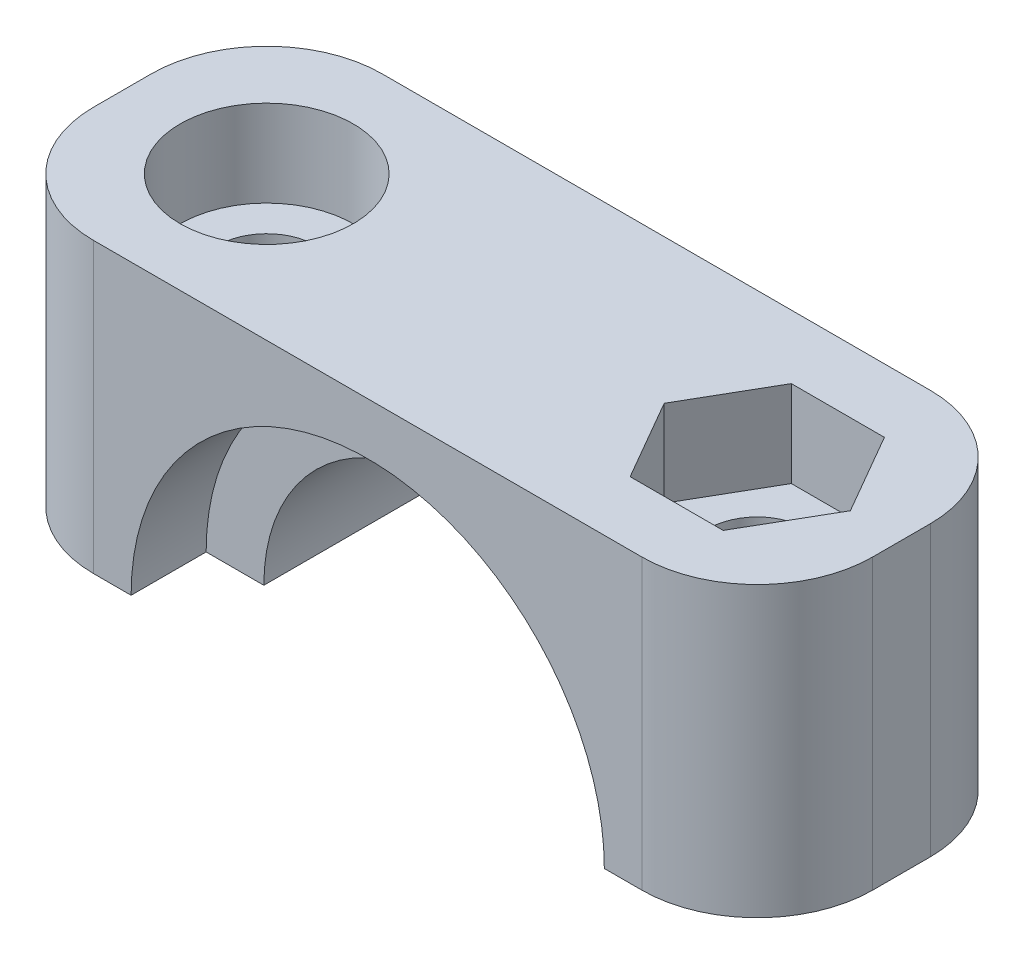
ISO-10303-21;
HEADER;
FILE_DESCRIPTION(('STEP AP214'),'2;1');
FILE_NAME('part.step','',(''),(''),'','','');
FILE_SCHEMA(('AUTOMOTIVE_DESIGN { 1 0 10303 214 1 1 1 1 }'));
ENDSEC;
DATA;
#1=APPLICATION_CONTEXT('core data for automotive mechanical design processes');
#2=APPLICATION_PROTOCOL_DEFINITION('international standard','automotive_design',2000,#1);
#3=PRODUCT_CONTEXT('',#1,'mechanical');
#4=PRODUCT('Part','Part','',(#3));
#5=PRODUCT_RELATED_PRODUCT_CATEGORY('part','',(#4));
#6=PRODUCT_DEFINITION_FORMATION('','',#4);
#7=PRODUCT_DEFINITION_CONTEXT('part definition',#1,'design');
#8=PRODUCT_DEFINITION('design','',#6,#7);
#9=PRODUCT_DEFINITION_SHAPE('','',#8);
#10=(LENGTH_UNIT() NAMED_UNIT(*) SI_UNIT(.MILLI.,.METRE.));
#11=(NAMED_UNIT(*) PLANE_ANGLE_UNIT() SI_UNIT($,.RADIAN.));
#12=(NAMED_UNIT(*) SI_UNIT($,.STERADIAN.) SOLID_ANGLE_UNIT());
#13=UNCERTAINTY_MEASURE_WITH_UNIT(LENGTH_MEASURE(1.E-05),#10,'distance_accuracy_value','');
#14=(GEOMETRIC_REPRESENTATION_CONTEXT(3) GLOBAL_UNCERTAINTY_ASSIGNED_CONTEXT((#13)) GLOBAL_UNIT_ASSIGNED_CONTEXT((#10,
#11,#12)) REPRESENTATION_CONTEXT('',''));
#15=CARTESIAN_POINT('',(0.,0.,0.));
#16=DIRECTION('',(0.,0.,1.));
#17=DIRECTION('',(1.,0.,0.));
#18=AXIS2_PLACEMENT_3D('',#15,#16,#17);
#19=CARTESIAN_POINT('',(8.5,-5.,5.));
#20=DIRECTION('',(0.,1.,0.));
#21=DIRECTION('',(0.,0.,1.));
#22=AXIS2_PLACEMENT_3D('',#19,#20,#21);
#23=CYLINDRICAL_SURFACE('',#22,1.7);
#24=CARTESIAN_POINT('',(8.5,-5.,5.));
#25=DIRECTION('',(0.,1.,0.));
#26=DIRECTION('',(0.,0.,1.));
#27=AXIS2_PLACEMENT_3D('',#24,#25,#26);
#28=CIRCLE('',#27,1.7);
#29=CARTESIAN_POINT('',(8.5,-5.,6.7));
#30=VERTEX_POINT('',#29);
#31=EDGE_CURVE('E233',#30,#30,#28,.T.);
#32=ORIENTED_EDGE('',*,*,#31,.F.);
#33=EDGE_LOOP('',(#32));
#34=FACE_BOUND('',#33,.T.);
#35=CARTESIAN_POINT('',(8.5,2.,5.));
#36=DIRECTION('',(0.,1.,0.));
#37=DIRECTION('',(0.,0.,1.));
#38=AXIS2_PLACEMENT_3D('',#35,#36,#37);
#39=CIRCLE('',#38,1.7);
#40=CARTESIAN_POINT('',(8.5,2.,6.7));
#41=VERTEX_POINT('',#40);
#42=EDGE_CURVE('E36',#41,#41,#39,.F.);
#43=ORIENTED_EDGE('',*,*,#42,.F.);
#44=EDGE_LOOP('',(#43));
#45=FACE_BOUND('',#44,.T.);
#46=ADVANCED_FACE('F32',(#34,#45),#23,.F.);
#47=CARTESIAN_POINT('',(-8.5,-5.,5.));
#48=DIRECTION('',(0.,1.,0.));
#49=DIRECTION('',(0.,0.,1.));
#50=AXIS2_PLACEMENT_3D('',#47,#48,#49);
#51=CYLINDRICAL_SURFACE('',#50,1.7);
#52=CARTESIAN_POINT('',(-8.5,-5.,5.));
#53=DIRECTION('',(0.,1.,0.));
#54=DIRECTION('',(0.,0.,1.));
#55=AXIS2_PLACEMENT_3D('',#52,#53,#54);
#56=CIRCLE('',#55,1.7);
#57=CARTESIAN_POINT('',(-8.5,-5.,6.7));
#58=VERTEX_POINT('',#57);
#59=EDGE_CURVE('E236',#58,#58,#56,.T.);
#60=ORIENTED_EDGE('',*,*,#59,.F.);
#61=EDGE_LOOP('',(#60));
#62=FACE_BOUND('',#61,.T.);
#63=CARTESIAN_POINT('',(-8.5,2.,5.));
#64=DIRECTION('',(0.,1.,0.));
#65=DIRECTION('',(0.,0.,1.));
#66=AXIS2_PLACEMENT_3D('',#63,#64,#65);
#67=CIRCLE('',#66,1.7);
#68=CARTESIAN_POINT('',(-8.5,2.,6.7));
#69=VERTEX_POINT('',#68);
#70=EDGE_CURVE('E229',#69,#69,#67,.F.);
#71=ORIENTED_EDGE('',*,*,#70,.F.);
#72=EDGE_LOOP('',(#71));
#73=FACE_BOUND('',#72,.T.);
#74=ADVANCED_FACE('F339',(#62,#73),#51,.F.);
#75=CARTESIAN_POINT('',(0.,-5.,10.));
#76=DIRECTION('',(0.,0.,-1.));
#77=DIRECTION('',(-1.,0.,0.));
#78=AXIS2_PLACEMENT_3D('',#75,#76,#77);
#79=CYLINDRICAL_SURFACE('',#78,8.2);
#80=CARTESIAN_POINT('',(0.,-5.,2.));
#81=DIRECTION('',(0.,0.,1.));
#82=DIRECTION('',(1.,0.,0.));
#83=AXIS2_PLACEMENT_3D('',#80,#81,#82);
#84=CIRCLE('',#83,8.2);
#85=CARTESIAN_POINT('',(8.2,-5.,2.));
#86=VERTEX_POINT('',#85);
#87=CARTESIAN_POINT('',(-8.2,-5.,2.));
#88=VERTEX_POINT('',#87);
#89=EDGE_CURVE('E239',#86,#88,#84,.T.);
#90=ORIENTED_EDGE('',*,*,#89,.T.);
#91=DIRECTION('',(0.,0.,-1.));
#92=VECTOR('',#91,1.);
#93=CARTESIAN_POINT('',(-8.2,-5.,10.));
#94=LINE('',#93,#92);
#95=CARTESIAN_POINT('',(-8.2,-5.,0.));
#96=VERTEX_POINT('',#95);
#97=EDGE_CURVE('E269',#96,#88,#94,.F.);
#98=ORIENTED_EDGE('',*,*,#97,.F.);
#99=CARTESIAN_POINT('',(0.,-5.,0.));
#100=DIRECTION('',(0.,0.,-1.));
#101=DIRECTION('',(-1.,0.,0.));
#102=AXIS2_PLACEMENT_3D('',#99,#100,#101);
#103=CIRCLE('',#102,8.2);
#104=CARTESIAN_POINT('',(8.2,-5.,0.));
#105=VERTEX_POINT('',#104);
#106=EDGE_CURVE('E262',#96,#105,#103,.T.);
#107=ORIENTED_EDGE('',*,*,#106,.T.);
#108=DIRECTION('',(0.,0.,-1.));
#109=VECTOR('',#108,1.);
#110=CARTESIAN_POINT('',(8.2,-5.,10.));
#111=LINE('',#110,#109);
#112=EDGE_CURVE('E272',#86,#105,#111,.T.);
#113=ORIENTED_EDGE('',*,*,#112,.F.);
#114=EDGE_LOOP('',(#90,#98,#107,#113));
#115=FACE_BOUND('',#114,.T.);
#116=ADVANCED_FACE('F341',(#115),#79,.F.);
#117=CARTESIAN_POINT('',(-13.5,-5.,10.));
#118=DIRECTION('',(0.,1.,0.));
#119=DIRECTION('',(0.,0.,1.));
#120=AXIS2_PLACEMENT_3D('',#117,#118,#119);
#121=PLANE('',#120);
#122=ORIENTED_EDGE('',*,*,#31,.T.);
#123=EDGE_LOOP('',(#122));
#124=FACE_BOUND('',#123,.T.);
#125=DIRECTION('',(1.,0.,0.));
#126=VECTOR('',#125,1.);
#127=CARTESIAN_POINT('',(-13.5,-5.,10.));
#128=LINE('',#127,#126);
#129=CARTESIAN_POINT('',(8.2,-5.,10.));
#130=VERTEX_POINT('',#129);
#131=CARTESIAN_POINT('',(9.5,-5.,10.));
#132=VERTEX_POINT('',#131);
#133=EDGE_CURVE('E279',#130,#132,#128,.T.);
#134=ORIENTED_EDGE('',*,*,#133,.F.);
#135=CARTESIAN_POINT('',(8.2,-5.,7.4));
#136=VERTEX_POINT('',#135);
#137=EDGE_CURVE('E273',#130,#136,#111,.T.);
#138=ORIENTED_EDGE('',*,*,#137,.T.);
#139=DIRECTION('',(1.,0.,0.));
#140=VECTOR('',#139,1.);
#141=CARTESIAN_POINT('',(8.2,-5.,7.4));
#142=LINE('',#141,#140);
#143=CARTESIAN_POINT('',(6.2,-5.,7.4));
#144=VERTEX_POINT('',#143);
#145=EDGE_CURVE('E246',#144,#136,#142,.T.);
#146=ORIENTED_EDGE('',*,*,#145,.F.);
#147=DIRECTION('',(0.,0.,-1.));
#148=VECTOR('',#147,1.);
#149=CARTESIAN_POINT('',(6.2,-5.,7.4));
#150=LINE('',#149,#148);
#151=CARTESIAN_POINT('',(6.2,-5.,2.));
#152=VERTEX_POINT('',#151);
#153=EDGE_CURVE('E249',#144,#152,#150,.T.);
#154=ORIENTED_EDGE('',*,*,#153,.T.);
#155=DIRECTION('',(1.,0.,0.));
#156=VECTOR('',#155,1.);
#157=CARTESIAN_POINT('',(8.2,-5.,2.));
#158=LINE('',#157,#156);
#159=EDGE_CURVE('E242',#152,#86,#158,.T.);
#160=ORIENTED_EDGE('',*,*,#159,.T.);
#161=ORIENTED_EDGE('',*,*,#112,.T.);
#162=DIRECTION('',(1.,0.,0.));
#163=VECTOR('',#162,1.);
#164=CARTESIAN_POINT('',(-13.5,-5.,0.));
#165=LINE('',#164,#163);
#166=CARTESIAN_POINT('',(9.5,-5.,0.));
#167=VERTEX_POINT('',#166);
#168=EDGE_CURVE('E287',#105,#167,#165,.T.);
#169=ORIENTED_EDGE('',*,*,#168,.T.);
#170=CARTESIAN_POINT('',(9.5,-5.,4.));
#171=DIRECTION('',(0.,1.,0.));
#172=DIRECTION('',(0.,0.,1.));
#173=AXIS2_PLACEMENT_3D('',#170,#171,#172);
#174=CIRCLE('',#173,4.);
#175=CARTESIAN_POINT('',(13.5,-5.,4.));
#176=VERTEX_POINT('',#175);
#177=EDGE_CURVE('E326',#167,#176,#174,.F.);
#178=ORIENTED_EDGE('',*,*,#177,.T.);
#179=DIRECTION('',(0.,0.,-1.));
#180=VECTOR('',#179,1.);
#181=CARTESIAN_POINT('',(13.5,-5.,10.));
#182=LINE('',#181,#180);
#183=CARTESIAN_POINT('',(13.5,-5.,6.));
#184=VERTEX_POINT('',#183);
#185=EDGE_CURVE('E284',#184,#176,#182,.T.);
#186=ORIENTED_EDGE('',*,*,#185,.F.);
#187=CARTESIAN_POINT('',(9.5,-5.,6.));
#188=DIRECTION('',(0.,1.,0.));
#189=DIRECTION('',(0.,0.,1.));
#190=AXIS2_PLACEMENT_3D('',#187,#188,#189);
#191=CIRCLE('',#190,4.);
#192=EDGE_CURVE('E323',#184,#132,#191,.F.);
#193=ORIENTED_EDGE('',*,*,#192,.T.);
#194=EDGE_LOOP('',(#134,#138,#146,#154,#160,#161,#169,#178,#186,#193));
#195=FACE_BOUND('',#194,.T.);
#196=ADVANCED_FACE('F348',(#124,#195),#121,.F.);
#197=CARTESIAN_POINT('',(13.5,-5.,10.));
#198=DIRECTION('',(-1.,0.,0.));
#199=DIRECTION('',(0.,0.,1.));
#200=AXIS2_PLACEMENT_3D('',#197,#198,#199);
#201=PLANE('',#200);
#202=ORIENTED_EDGE('',*,*,#185,.T.);
#203=DIRECTION('',(0.,1.,0.));
#204=VECTOR('',#203,1.);
#205=CARTESIAN_POINT('',(13.5,5.,4.));
#206=LINE('',#205,#204);
#207=CARTESIAN_POINT('',(13.5,5.,4.));
#208=VERTEX_POINT('',#207);
#209=EDGE_CURVE('E303',#176,#208,#206,.T.);
#210=ORIENTED_EDGE('',*,*,#209,.T.);
#211=DIRECTION('',(0.,0.,-1.));
#212=VECTOR('',#211,1.);
#213=CARTESIAN_POINT('',(13.5,5.,10.));
#214=LINE('',#213,#212);
#215=CARTESIAN_POINT('',(13.5,5.,6.));
#216=VERTEX_POINT('',#215);
#217=EDGE_CURVE('E298',#216,#208,#214,.T.);
#218=ORIENTED_EDGE('',*,*,#217,.F.);
#219=DIRECTION('',(0.,1.,0.));
#220=VECTOR('',#219,1.);
#221=CARTESIAN_POINT('',(13.5,-5.,6.));
#222=LINE('',#221,#220);
#223=EDGE_CURVE('E301',#216,#184,#222,.F.);
#224=ORIENTED_EDGE('',*,*,#223,.T.);
#225=EDGE_LOOP('',(#202,#210,#218,#224));
#226=FACE_BOUND('',#225,.T.);
#227=ADVANCED_FACE('F390',(#226),#201,.F.);
#228=CARTESIAN_POINT('',(-13.5,5.,10.));
#229=DIRECTION('',(0.,-1.,0.));
#230=DIRECTION('',(0.,0.,-1.));
#231=AXIS2_PLACEMENT_3D('',#228,#229,#230);
#232=PLANE('',#231);
#233=DIRECTION('',(1.,0.,0.));
#234=VECTOR('',#233,1.);
#235=CARTESIAN_POINT('',(6.88728460632127,5.,7.793305));
#236=LINE('',#235,#234);
#237=CARTESIAN_POINT('',(6.88728460632127,5.,7.793305));
#238=VERTEX_POINT('',#237);
#239=CARTESIAN_POINT('',(10.1127153936787,5.,7.793305));
#240=VERTEX_POINT('',#239);
#241=EDGE_CURVE('E207',#238,#240,#236,.T.);
#242=ORIENTED_EDGE('',*,*,#241,.F.);
#243=DIRECTION('',(0.5,0.,0.866025403784438));
#244=VECTOR('',#243,1.);
#245=CARTESIAN_POINT('',(5.27456921264254,5.,5.));
#246=LINE('',#245,#244);
#247=CARTESIAN_POINT('',(5.27456921264254,5.,5.));
#248=VERTEX_POINT('',#247);
#249=EDGE_CURVE('E49',#248,#238,#246,.T.);
#250=ORIENTED_EDGE('',*,*,#249,.F.);
#251=DIRECTION('',(-0.5,0.,0.866025403784439));
#252=VECTOR('',#251,1.);
#253=CARTESIAN_POINT('',(6.88728460632127,5.,2.206695));
#254=LINE('',#253,#252);
#255=CARTESIAN_POINT('',(6.88728460632127,5.,2.206695));
#256=VERTEX_POINT('',#255);
#257=EDGE_CURVE('E193',#256,#248,#254,.T.);
#258=ORIENTED_EDGE('',*,*,#257,.F.);
#259=DIRECTION('',(-1.,0.,0.));
#260=VECTOR('',#259,1.);
#261=CARTESIAN_POINT('',(10.1127153936787,5.,2.206695));
#262=LINE('',#261,#260);
#263=CARTESIAN_POINT('',(10.1127153936787,5.,2.206695));
#264=VERTEX_POINT('',#263);
#265=EDGE_CURVE('E196',#264,#256,#262,.T.);
#266=ORIENTED_EDGE('',*,*,#265,.F.);
#267=DIRECTION('',(-0.5,0.,-0.866025403784438));
#268=VECTOR('',#267,1.);
#269=CARTESIAN_POINT('',(11.7254307873575,5.,5.));
#270=LINE('',#269,#268);
#271=CARTESIAN_POINT('',(11.7254307873575,5.,5.));
#272=VERTEX_POINT('',#271);
#273=EDGE_CURVE('E212',#272,#264,#270,.T.);
#274=ORIENTED_EDGE('',*,*,#273,.F.);
#275=DIRECTION('',(0.5,0.,-0.866025403784439));
#276=VECTOR('',#275,1.);
#277=CARTESIAN_POINT('',(10.1127153936787,5.,7.793305));
#278=LINE('',#277,#276);
#279=EDGE_CURVE('E209',#240,#272,#278,.T.);
#280=ORIENTED_EDGE('',*,*,#279,.F.);
#281=EDGE_LOOP('',(#242,#250,#258,#266,#274,#280));
#282=FACE_BOUND('',#281,.T.);
#283=CARTESIAN_POINT('',(-8.5,5.,5.));
#284=DIRECTION('',(0.,1.,0.));
#285=DIRECTION('',(0.,0.,1.));
#286=AXIS2_PLACEMENT_3D('',#283,#284,#285);
#287=CIRCLE('',#286,3.);
#288=CARTESIAN_POINT('',(-8.5,5.,8.));
#289=VERTEX_POINT('',#288);
#290=EDGE_CURVE('E230',#289,#289,#287,.T.);
#291=ORIENTED_EDGE('',*,*,#290,.F.);
#292=EDGE_LOOP('',(#291));
#293=FACE_BOUND('',#292,.T.);
#294=ORIENTED_EDGE('',*,*,#217,.T.);
#295=CARTESIAN_POINT('',(9.5,5.,4.));
#296=DIRECTION('',(0.,-1.,0.));
#297=DIRECTION('',(0.,0.,-1.));
#298=AXIS2_PLACEMENT_3D('',#295,#296,#297);
#299=CIRCLE('',#298,4.);
#300=CARTESIAN_POINT('',(9.5,5.,0.));
#301=VERTEX_POINT('',#300);
#302=EDGE_CURVE('E312',#208,#301,#299,.F.);
#303=ORIENTED_EDGE('',*,*,#302,.T.);
#304=DIRECTION('',(-1.,0.,0.));
#305=VECTOR('',#304,1.);
#306=CARTESIAN_POINT('',(-13.5,5.,0.));
#307=LINE('',#306,#305);
#308=CARTESIAN_POINT('',(-9.5,5.,0.));
#309=VERTEX_POINT('',#308);
#310=EDGE_CURVE('E275',#301,#309,#307,.T.);
#311=ORIENTED_EDGE('',*,*,#310,.T.);
#312=CARTESIAN_POINT('',(-9.5,5.,4.));
#313=DIRECTION('',(0.,-1.,0.));
#314=DIRECTION('',(0.,0.,-1.));
#315=AXIS2_PLACEMENT_3D('',#312,#313,#314);
#316=CIRCLE('',#315,4.);
#317=CARTESIAN_POINT('',(-13.5,5.,4.));
#318=VERTEX_POINT('',#317);
#319=EDGE_CURVE('E308',#309,#318,#316,.F.);
#320=ORIENTED_EDGE('',*,*,#319,.T.);
#321=DIRECTION('',(0.,0.,-1.));
#322=VECTOR('',#321,1.);
#323=CARTESIAN_POINT('',(-13.5,5.,10.));
#324=LINE('',#323,#322);
#325=CARTESIAN_POINT('',(-13.5,5.,6.));
#326=VERTEX_POINT('',#325);
#327=EDGE_CURVE('E295',#326,#318,#324,.T.);
#328=ORIENTED_EDGE('',*,*,#327,.F.);
#329=CARTESIAN_POINT('',(-9.5,5.,6.));
#330=DIRECTION('',(0.,-1.,0.));
#331=DIRECTION('',(0.,0.,-1.));
#332=AXIS2_PLACEMENT_3D('',#329,#330,#331);
#333=CIRCLE('',#332,4.);
#334=CARTESIAN_POINT('',(-9.5,5.,10.));
#335=VERTEX_POINT('',#334);
#336=EDGE_CURVE('E306',#326,#335,#333,.F.);
#337=ORIENTED_EDGE('',*,*,#336,.T.);
#338=DIRECTION('',(-1.,0.,0.));
#339=VECTOR('',#338,1.);
#340=CARTESIAN_POINT('',(-13.5,5.,10.));
#341=LINE('',#340,#339);
#342=CARTESIAN_POINT('',(9.5,5.,10.));
#343=VERTEX_POINT('',#342);
#344=EDGE_CURVE('E276',#343,#335,#341,.T.);
#345=ORIENTED_EDGE('',*,*,#344,.F.);
#346=CARTESIAN_POINT('',(9.5,5.,6.));
#347=DIRECTION('',(0.,-1.,0.));
#348=DIRECTION('',(0.,0.,-1.));
#349=AXIS2_PLACEMENT_3D('',#346,#347,#348);
#350=CIRCLE('',#349,4.);
#351=EDGE_CURVE('E310',#343,#216,#350,.F.);
#352=ORIENTED_EDGE('',*,*,#351,.T.);
#353=EDGE_LOOP('',(#294,#303,#311,#320,#328,#337,#345,#352));
#354=FACE_BOUND('',#353,.T.);
#355=ADVANCED_FACE('F386',(#282,#293,#354),#232,.F.);
#356=CARTESIAN_POINT('',(-13.5,-5.,10.));
#357=DIRECTION('',(1.,0.,0.));
#358=DIRECTION('',(0.,0.,-1.));
#359=AXIS2_PLACEMENT_3D('',#356,#357,#358);
#360=PLANE('',#359);
#361=ORIENTED_EDGE('',*,*,#327,.T.);
#362=DIRECTION('',(0.,-1.,0.));
#363=VECTOR('',#362,1.);
#364=CARTESIAN_POINT('',(-13.5,-5.,4.));
#365=LINE('',#364,#363);
#366=CARTESIAN_POINT('',(-13.5,-5.,4.));
#367=VERTEX_POINT('',#366);
#368=EDGE_CURVE('E11',#318,#367,#365,.T.);
#369=ORIENTED_EDGE('',*,*,#368,.T.);
#370=DIRECTION('',(0.,0.,-1.));
#371=VECTOR('',#370,1.);
#372=CARTESIAN_POINT('',(-13.5,-5.,10.));
#373=LINE('',#372,#371);
#374=CARTESIAN_POINT('',(-13.5,-5.,6.));
#375=VERTEX_POINT('',#374);
#376=EDGE_CURVE('E292',#375,#367,#373,.T.);
#377=ORIENTED_EDGE('',*,*,#376,.F.);
#378=DIRECTION('',(0.,-1.,0.));
#379=VECTOR('',#378,1.);
#380=CARTESIAN_POINT('',(-13.5,-5.,6.));
#381=LINE('',#380,#379);
#382=EDGE_CURVE('E41',#375,#326,#381,.F.);
#383=ORIENTED_EDGE('',*,*,#382,.T.);
#384=EDGE_LOOP('',(#361,#369,#377,#383));
#385=FACE_BOUND('',#384,.T.);
#386=ADVANCED_FACE('F382',(#385),#360,.F.);
#387=ORIENTED_EDGE('',*,*,#59,.T.);
#388=EDGE_LOOP('',(#387));
#389=FACE_BOUND('',#388,.T.);
#390=CARTESIAN_POINT('',(-9.5,-5.,0.));
#391=VERTEX_POINT('',#390);
#392=EDGE_CURVE('E280',#391,#96,#165,.T.);
#393=ORIENTED_EDGE('',*,*,#392,.T.);
#394=ORIENTED_EDGE('',*,*,#97,.T.);
#395=DIRECTION('',(1.,0.,0.));
#396=VECTOR('',#395,1.);
#397=CARTESIAN_POINT('',(-6.2,-5.,2.));
#398=LINE('',#397,#396);
#399=CARTESIAN_POINT('',(-6.2,-5.,2.));
#400=VERTEX_POINT('',#399);
#401=EDGE_CURVE('E251',#88,#400,#398,.T.);
#402=ORIENTED_EDGE('',*,*,#401,.T.);
#403=DIRECTION('',(0.,0.,-1.));
#404=VECTOR('',#403,1.);
#405=CARTESIAN_POINT('',(-6.2,-5.,7.4));
#406=LINE('',#405,#404);
#407=CARTESIAN_POINT('',(-6.2,-5.,7.4));
#408=VERTEX_POINT('',#407);
#409=EDGE_CURVE('E259',#408,#400,#406,.T.);
#410=ORIENTED_EDGE('',*,*,#409,.F.);
#411=DIRECTION('',(1.,0.,0.));
#412=VECTOR('',#411,1.);
#413=CARTESIAN_POINT('',(-6.2,-5.,7.4));
#414=LINE('',#413,#412);
#415=CARTESIAN_POINT('',(-8.2,-5.,7.4));
#416=VERTEX_POINT('',#415);
#417=EDGE_CURVE('E241',#416,#408,#414,.T.);
#418=ORIENTED_EDGE('',*,*,#417,.F.);
#419=CARTESIAN_POINT('',(-8.2,-5.,10.));
#420=VERTEX_POINT('',#419);
#421=EDGE_CURVE('E266',#416,#420,#94,.F.);
#422=ORIENTED_EDGE('',*,*,#421,.T.);
#423=CARTESIAN_POINT('',(-9.5,-5.,10.));
#424=VERTEX_POINT('',#423);
#425=EDGE_CURVE('E281',#424,#420,#128,.T.);
#426=ORIENTED_EDGE('',*,*,#425,.F.);
#427=CARTESIAN_POINT('',(-9.5,-5.,6.));
#428=DIRECTION('',(0.,1.,0.));
#429=DIRECTION('',(0.,0.,1.));
#430=AXIS2_PLACEMENT_3D('',#427,#428,#429);
#431=CIRCLE('',#430,4.);
#432=EDGE_CURVE('E319',#424,#375,#431,.F.);
#433=ORIENTED_EDGE('',*,*,#432,.T.);
#434=ORIENTED_EDGE('',*,*,#376,.T.);
#435=CARTESIAN_POINT('',(-9.5,-5.,4.));
#436=DIRECTION('',(0.,1.,0.));
#437=DIRECTION('',(0.,0.,1.));
#438=AXIS2_PLACEMENT_3D('',#435,#436,#437);
#439=CIRCLE('',#438,4.);
#440=EDGE_CURVE('E321',#367,#391,#439,.F.);
#441=ORIENTED_EDGE('',*,*,#440,.T.);
#442=EDGE_LOOP('',(#393,#394,#402,#410,#418,#422,#426,#433,#434,#441));
#443=FACE_BOUND('',#442,.T.);
#444=ADVANCED_FACE('F374',(#389,#443),#121,.F.);
#445=CARTESIAN_POINT('',(0.,0.,10.));
#446=DIRECTION('',(0.,0.,-1.));
#447=DIRECTION('',(-1.,0.,0.));
#448=AXIS2_PLACEMENT_3D('',#445,#446,#447);
#449=PLANE('',#448);
#450=ORIENTED_EDGE('',*,*,#425,.T.);
#451=CARTESIAN_POINT('',(0.,-5.,10.));
#452=DIRECTION('',(0.,0.,-1.));
#453=DIRECTION('',(-1.,0.,0.));
#454=AXIS2_PLACEMENT_3D('',#451,#452,#453);
#455=CIRCLE('',#454,8.2);
#456=EDGE_CURVE('E263',#420,#130,#455,.T.);
#457=ORIENTED_EDGE('',*,*,#456,.T.);
#458=ORIENTED_EDGE('',*,*,#133,.T.);
#459=DIRECTION('',(0.,1.,0.));
#460=VECTOR('',#459,1.);
#461=CARTESIAN_POINT('',(9.5,0.,10.));
#462=LINE('',#461,#460);
#463=EDGE_CURVE('E331',#132,#343,#462,.T.);
#464=ORIENTED_EDGE('',*,*,#463,.T.);
#465=ORIENTED_EDGE('',*,*,#344,.T.);
#466=DIRECTION('',(0.,-1.,0.));
#467=VECTOR('',#466,1.);
#468=CARTESIAN_POINT('',(-9.5,0.,10.));
#469=LINE('',#468,#467);
#470=EDGE_CURVE('E328',#335,#424,#469,.T.);
#471=ORIENTED_EDGE('',*,*,#470,.T.);
#472=EDGE_LOOP('',(#450,#457,#458,#464,#465,#471));
#473=FACE_BOUND('',#472,.T.);
#474=ADVANCED_FACE('F370',(#473),#449,.F.);
#475=CARTESIAN_POINT('',(0.,0.,0.));
#476=DIRECTION('',(0.,0.,-1.));
#477=DIRECTION('',(-1.,0.,0.));
#478=AXIS2_PLACEMENT_3D('',#475,#476,#477);
#479=PLANE('',#478);
#480=ORIENTED_EDGE('',*,*,#106,.F.);
#481=ORIENTED_EDGE('',*,*,#392,.F.);
#482=DIRECTION('',(0.,-1.,0.));
#483=VECTOR('',#482,1.);
#484=CARTESIAN_POINT('',(-9.5,5.,0.));
#485=LINE('',#484,#483);
#486=EDGE_CURVE('E314',#391,#309,#485,.F.);
#487=ORIENTED_EDGE('',*,*,#486,.T.);
#488=ORIENTED_EDGE('',*,*,#310,.F.);
#489=DIRECTION('',(0.,1.,0.));
#490=VECTOR('',#489,1.);
#491=CARTESIAN_POINT('',(9.5,-5.,0.));
#492=LINE('',#491,#490);
#493=EDGE_CURVE('E316',#301,#167,#492,.F.);
#494=ORIENTED_EDGE('',*,*,#493,.T.);
#495=ORIENTED_EDGE('',*,*,#168,.F.);
#496=EDGE_LOOP('',(#480,#481,#487,#488,#494,#495));
#497=FACE_BOUND('',#496,.T.);
#498=ADVANCED_FACE('F373',(#497),#479,.T.);
#499=CARTESIAN_POINT('',(9.5,-5.,4.));
#500=DIRECTION('',(0.,-1.,0.));
#501=DIRECTION('',(0.,0.,-1.));
#502=AXIS2_PLACEMENT_3D('',#499,#500,#501);
#503=CYLINDRICAL_SURFACE('',#502,4.);
#504=ORIENTED_EDGE('',*,*,#177,.F.);
#505=ORIENTED_EDGE('',*,*,#493,.F.);
#506=ORIENTED_EDGE('',*,*,#302,.F.);
#507=ORIENTED_EDGE('',*,*,#209,.F.);
#508=EDGE_LOOP('',(#504,#505,#506,#507));
#509=FACE_BOUND('',#508,.T.);
#510=ADVANCED_FACE('F378',(#509),#503,.T.);
#511=CARTESIAN_POINT('',(9.5,0.,6.));
#512=DIRECTION('',(0.,1.,0.));
#513=DIRECTION('',(0.,0.,1.));
#514=AXIS2_PLACEMENT_3D('',#511,#512,#513);
#515=CYLINDRICAL_SURFACE('',#514,4.);
#516=ORIENTED_EDGE('',*,*,#192,.F.);
#517=ORIENTED_EDGE('',*,*,#223,.F.);
#518=ORIENTED_EDGE('',*,*,#351,.F.);
#519=ORIENTED_EDGE('',*,*,#463,.F.);
#520=EDGE_LOOP('',(#516,#517,#518,#519));
#521=FACE_BOUND('',#520,.T.);
#522=ADVANCED_FACE('F397',(#521),#515,.T.);
#523=CARTESIAN_POINT('',(-9.5,-5.,4.));
#524=DIRECTION('',(0.,1.,0.));
#525=DIRECTION('',(0.,0.,1.));
#526=AXIS2_PLACEMENT_3D('',#523,#524,#525);
#527=CYLINDRICAL_SURFACE('',#526,4.);
#528=ORIENTED_EDGE('',*,*,#319,.F.);
#529=ORIENTED_EDGE('',*,*,#486,.F.);
#530=ORIENTED_EDGE('',*,*,#440,.F.);
#531=ORIENTED_EDGE('',*,*,#368,.F.);
#532=EDGE_LOOP('',(#528,#529,#530,#531));
#533=FACE_BOUND('',#532,.T.);
#534=ADVANCED_FACE('F400',(#533),#527,.T.);
#535=CARTESIAN_POINT('',(-9.5,0.,6.));
#536=DIRECTION('',(0.,-1.,0.));
#537=DIRECTION('',(0.,0.,-1.));
#538=AXIS2_PLACEMENT_3D('',#535,#536,#537);
#539=CYLINDRICAL_SURFACE('',#538,4.);
#540=ORIENTED_EDGE('',*,*,#336,.F.);
#541=ORIENTED_EDGE('',*,*,#382,.F.);
#542=ORIENTED_EDGE('',*,*,#432,.F.);
#543=ORIENTED_EDGE('',*,*,#470,.F.);
#544=EDGE_LOOP('',(#540,#541,#542,#543));
#545=FACE_BOUND('',#544,.T.);
#546=ADVANCED_FACE('F34',(#545),#539,.T.);
#547=ORIENTED_EDGE('',*,*,#421,.F.);
#548=CARTESIAN_POINT('',(0.,-5.,7.4));
#549=DIRECTION('',(0.,0.,1.));
#550=DIRECTION('',(1.,0.,0.));
#551=AXIS2_PLACEMENT_3D('',#548,#549,#550);
#552=CIRCLE('',#551,8.2);
#553=EDGE_CURVE('E57',#136,#416,#552,.T.);
#554=ORIENTED_EDGE('',*,*,#553,.F.);
#555=ORIENTED_EDGE('',*,*,#137,.F.);
#556=ORIENTED_EDGE('',*,*,#456,.F.);
#557=EDGE_LOOP('',(#547,#554,#555,#556));
#558=FACE_BOUND('',#557,.T.);
#559=ADVANCED_FACE('F351',(#558),#79,.F.);
#560=CARTESIAN_POINT('',(0.,-5.,7.4));
#561=DIRECTION('',(0.,0.,-1.));
#562=DIRECTION('',(-1.,0.,0.));
#563=AXIS2_PLACEMENT_3D('',#560,#561,#562);
#564=CYLINDRICAL_SURFACE('',#563,6.2);
#565=CARTESIAN_POINT('',(0.,-5.,2.));
#566=DIRECTION('',(0.,0.,-1.));
#567=DIRECTION('',(1.,0.,0.));
#568=AXIS2_PLACEMENT_3D('',#565,#566,#567);
#569=CIRCLE('',#568,6.2);
#570=EDGE_CURVE('E253',#400,#152,#569,.T.);
#571=ORIENTED_EDGE('',*,*,#570,.T.);
#572=ORIENTED_EDGE('',*,*,#153,.F.);
#573=CARTESIAN_POINT('',(0.,-5.,7.4));
#574=DIRECTION('',(0.,0.,-1.));
#575=DIRECTION('',(1.,0.,0.));
#576=AXIS2_PLACEMENT_3D('',#573,#574,#575);
#577=CIRCLE('',#576,6.2);
#578=EDGE_CURVE('E244',#408,#144,#577,.T.);
#579=ORIENTED_EDGE('',*,*,#578,.F.);
#580=ORIENTED_EDGE('',*,*,#409,.T.);
#581=EDGE_LOOP('',(#571,#572,#579,#580));
#582=FACE_BOUND('',#581,.T.);
#583=ADVANCED_FACE('F361',(#582),#564,.F.);
#584=CARTESIAN_POINT('',(0.,-5.,7.4));
#585=DIRECTION('',(0.,0.,1.));
#586=DIRECTION('',(1.,0.,0.));
#587=AXIS2_PLACEMENT_3D('',#584,#585,#586);
#588=PLANE('',#587);
#589=ORIENTED_EDGE('',*,*,#553,.T.);
#590=ORIENTED_EDGE('',*,*,#417,.T.);
#591=ORIENTED_EDGE('',*,*,#578,.T.);
#592=ORIENTED_EDGE('',*,*,#145,.T.);
#593=EDGE_LOOP('',(#589,#590,#591,#592));
#594=FACE_BOUND('',#593,.T.);
#595=ADVANCED_FACE('F357',(#594),#588,.T.);
#596=CARTESIAN_POINT('',(0.,-5.,2.));
#597=DIRECTION('',(0.,0.,1.));
#598=DIRECTION('',(1.,0.,0.));
#599=AXIS2_PLACEMENT_3D('',#596,#597,#598);
#600=PLANE('',#599);
#601=ORIENTED_EDGE('',*,*,#89,.F.);
#602=ORIENTED_EDGE('',*,*,#159,.F.);
#603=ORIENTED_EDGE('',*,*,#570,.F.);
#604=ORIENTED_EDGE('',*,*,#401,.F.);
#605=EDGE_LOOP('',(#601,#602,#603,#604));
#606=FACE_BOUND('',#605,.T.);
#607=ADVANCED_FACE('F360',(#606),#600,.F.);
#608=CARTESIAN_POINT('',(-8.5,2.,5.));
#609=DIRECTION('',(0.,1.,0.));
#610=DIRECTION('',(0.,0.,1.));
#611=AXIS2_PLACEMENT_3D('',#608,#609,#610);
#612=PLANE('',#611);
#613=CARTESIAN_POINT('',(-8.5,2.,5.));
#614=DIRECTION('',(0.,1.,0.));
#615=DIRECTION('',(0.,0.,1.));
#616=AXIS2_PLACEMENT_3D('',#613,#614,#615);
#617=CIRCLE('',#616,3.);
#618=CARTESIAN_POINT('',(-8.5,2.,8.));
#619=VERTEX_POINT('',#618);
#620=EDGE_CURVE('E226',#619,#619,#617,.T.);
#621=ORIENTED_EDGE('',*,*,#620,.T.);
#622=EDGE_LOOP('',(#621));
#623=FACE_BOUND('',#622,.T.);
#624=ORIENTED_EDGE('',*,*,#70,.T.);
#625=EDGE_LOOP('',(#624));
#626=FACE_BOUND('',#625,.T.);
#627=ADVANCED_FACE('F337',(#623,#626),#612,.T.);
#628=CARTESIAN_POINT('',(-8.5,2.,5.));
#629=DIRECTION('',(0.,1.,0.));
#630=DIRECTION('',(0.,0.,1.));
#631=AXIS2_PLACEMENT_3D('',#628,#629,#630);
#632=CYLINDRICAL_SURFACE('',#631,3.);
#633=ORIENTED_EDGE('',*,*,#620,.F.);
#634=EDGE_LOOP('',(#633));
#635=FACE_BOUND('',#634,.T.);
#636=ORIENTED_EDGE('',*,*,#290,.T.);
#637=EDGE_LOOP('',(#636));
#638=FACE_BOUND('',#637,.T.);
#639=ADVANCED_FACE('F453',(#635,#638),#632,.F.);
#640=CARTESIAN_POINT('',(0.,2.,0.));
#641=DIRECTION('',(0.,1.,0.));
#642=DIRECTION('',(0.,0.,1.));
#643=AXIS2_PLACEMENT_3D('',#640,#641,#642);
#644=PLANE('',#643);
#645=DIRECTION('',(0.5,0.,0.866025403784438));
#646=VECTOR('',#645,1.);
#647=CARTESIAN_POINT('',(5.27456921264254,2.,5.));
#648=LINE('',#647,#646);
#649=CARTESIAN_POINT('',(5.27456921264254,2.,5.));
#650=VERTEX_POINT('',#649);
#651=CARTESIAN_POINT('',(6.88728460632127,2.,7.793305));
#652=VERTEX_POINT('',#651);
#653=EDGE_CURVE('E173',#650,#652,#648,.T.);
#654=ORIENTED_EDGE('',*,*,#653,.T.);
#655=DIRECTION('',(1.,0.,0.));
#656=VECTOR('',#655,1.);
#657=CARTESIAN_POINT('',(6.88728460632127,2.,7.793305));
#658=LINE('',#657,#656);
#659=CARTESIAN_POINT('',(10.1127153936787,2.,7.793305));
#660=VERTEX_POINT('',#659);
#661=EDGE_CURVE('E182',#652,#660,#658,.T.);
#662=ORIENTED_EDGE('',*,*,#661,.T.);
#663=DIRECTION('',(0.5,0.,-0.866025403784439));
#664=VECTOR('',#663,1.);
#665=CARTESIAN_POINT('',(10.1127153936787,2.,7.793305));
#666=LINE('',#665,#664);
#667=CARTESIAN_POINT('',(11.7254307873575,2.,5.));
#668=VERTEX_POINT('',#667);
#669=EDGE_CURVE('E187',#660,#668,#666,.T.);
#670=ORIENTED_EDGE('',*,*,#669,.T.);
#671=DIRECTION('',(-0.5,0.,-0.866025403784438));
#672=VECTOR('',#671,1.);
#673=CARTESIAN_POINT('',(11.7254307873575,2.,5.));
#674=LINE('',#673,#672);
#675=CARTESIAN_POINT('',(10.1127153936787,2.,2.206695));
#676=VERTEX_POINT('',#675);
#677=EDGE_CURVE('E200',#668,#676,#674,.T.);
#678=ORIENTED_EDGE('',*,*,#677,.T.);
#679=DIRECTION('',(-1.,0.,0.));
#680=VECTOR('',#679,1.);
#681=CARTESIAN_POINT('',(10.1127153936787,2.,2.206695));
#682=LINE('',#681,#680);
#683=CARTESIAN_POINT('',(6.88728460632127,2.,2.206695));
#684=VERTEX_POINT('',#683);
#685=EDGE_CURVE('E203',#676,#684,#682,.T.);
#686=ORIENTED_EDGE('',*,*,#685,.T.);
#687=DIRECTION('',(-0.5,0.,0.866025403784439));
#688=VECTOR('',#687,1.);
#689=CARTESIAN_POINT('',(6.88728460632127,2.,2.206695));
#690=LINE('',#689,#688);
#691=EDGE_CURVE('E179',#684,#650,#690,.T.);
#692=ORIENTED_EDGE('',*,*,#691,.T.);
#693=EDGE_LOOP('',(#654,#662,#670,#678,#686,#692));
#694=FACE_BOUND('',#693,.T.);
#695=ORIENTED_EDGE('',*,*,#42,.T.);
#696=EDGE_LOOP('',(#695));
#697=FACE_BOUND('',#696,.T.);
#698=ADVANCED_FACE('F189',(#694,#697),#644,.T.);
#699=CARTESIAN_POINT('',(5.27456921264254,2.,5.));
#700=DIRECTION('',(-0.866025403784438,0.,0.5));
#701=DIRECTION('',(0.5,0.,0.866025403784439));
#702=AXIS2_PLACEMENT_3D('',#699,#700,#701);
#703=PLANE('',#702);
#704=ORIENTED_EDGE('',*,*,#249,.T.);
#705=DIRECTION('',(0.,1.,0.));
#706=VECTOR('',#705,1.);
#707=CARTESIAN_POINT('',(6.88728460632127,2.,7.793305));
#708=LINE('',#707,#706);
#709=EDGE_CURVE('E169',#652,#238,#708,.T.);
#710=ORIENTED_EDGE('',*,*,#709,.F.);
#711=ORIENTED_EDGE('',*,*,#653,.F.);
#712=DIRECTION('',(0.,1.,0.));
#713=VECTOR('',#712,1.);
#714=CARTESIAN_POINT('',(5.27456921264254,2.,5.));
#715=LINE('',#714,#713);
#716=EDGE_CURVE('E217',#650,#248,#715,.T.);
#717=ORIENTED_EDGE('',*,*,#716,.T.);
#718=EDGE_LOOP('',(#704,#710,#711,#717));
#719=FACE_BOUND('',#718,.T.);
#720=ADVANCED_FACE('F171',(#719),#703,.F.);
#721=CARTESIAN_POINT('',(6.88728460632127,2.,2.206695));
#722=DIRECTION('',(-0.866025403784438,0.,-0.5));
#723=DIRECTION('',(-0.5,0.,0.866025403784439));
#724=AXIS2_PLACEMENT_3D('',#721,#722,#723);
#725=PLANE('',#724);
#726=ORIENTED_EDGE('',*,*,#257,.T.);
#727=ORIENTED_EDGE('',*,*,#716,.F.);
#728=ORIENTED_EDGE('',*,*,#691,.F.);
#729=DIRECTION('',(0.,1.,0.));
#730=VECTOR('',#729,1.);
#731=CARTESIAN_POINT('',(6.88728460632127,2.,2.206695));
#732=LINE('',#731,#730);
#733=EDGE_CURVE('E219',#684,#256,#732,.T.);
#734=ORIENTED_EDGE('',*,*,#733,.T.);
#735=EDGE_LOOP('',(#726,#727,#728,#734));
#736=FACE_BOUND('',#735,.T.);
#737=ADVANCED_FACE('F459',(#736),#725,.F.);
#738=CARTESIAN_POINT('',(10.1127153936787,2.,2.206695));
#739=DIRECTION('',(0.,0.,-1.));
#740=DIRECTION('',(-1.,0.,0.));
#741=AXIS2_PLACEMENT_3D('',#738,#739,#740);
#742=PLANE('',#741);
#743=ORIENTED_EDGE('',*,*,#265,.T.);
#744=ORIENTED_EDGE('',*,*,#733,.F.);
#745=ORIENTED_EDGE('',*,*,#685,.F.);
#746=DIRECTION('',(0.,1.,0.));
#747=VECTOR('',#746,1.);
#748=CARTESIAN_POINT('',(10.1127153936787,2.,2.206695));
#749=LINE('',#748,#747);
#750=EDGE_CURVE('E221',#676,#264,#749,.T.);
#751=ORIENTED_EDGE('',*,*,#750,.T.);
#752=EDGE_LOOP('',(#743,#744,#745,#751));
#753=FACE_BOUND('',#752,.T.);
#754=ADVANCED_FACE('F465',(#753),#742,.F.);
#755=CARTESIAN_POINT('',(11.7254307873575,2.,5.));
#756=DIRECTION('',(0.866025403784438,0.,-0.5));
#757=DIRECTION('',(-0.5,0.,-0.866025403784438));
#758=AXIS2_PLACEMENT_3D('',#755,#756,#757);
#759=PLANE('',#758);
#760=ORIENTED_EDGE('',*,*,#273,.T.);
#761=ORIENTED_EDGE('',*,*,#750,.F.);
#762=ORIENTED_EDGE('',*,*,#677,.F.);
#763=DIRECTION('',(0.,1.,0.));
#764=VECTOR('',#763,1.);
#765=CARTESIAN_POINT('',(11.7254307873575,2.,5.));
#766=LINE('',#765,#764);
#767=EDGE_CURVE('E223',#668,#272,#766,.T.);
#768=ORIENTED_EDGE('',*,*,#767,.T.);
#769=EDGE_LOOP('',(#760,#761,#762,#768));
#770=FACE_BOUND('',#769,.T.);
#771=ADVANCED_FACE('F469',(#770),#759,.F.);
#772=CARTESIAN_POINT('',(10.1127153936787,2.,7.793305));
#773=DIRECTION('',(0.866025403784439,0.,0.5));
#774=DIRECTION('',(0.5,0.,-0.866025403784439));
#775=AXIS2_PLACEMENT_3D('',#772,#773,#774);
#776=PLANE('',#775);
#777=ORIENTED_EDGE('',*,*,#279,.T.);
#778=ORIENTED_EDGE('',*,*,#767,.F.);
#779=ORIENTED_EDGE('',*,*,#669,.F.);
#780=DIRECTION('',(0.,1.,0.));
#781=VECTOR('',#780,1.);
#782=CARTESIAN_POINT('',(10.1127153936787,2.,7.793305));
#783=LINE('',#782,#781);
#784=EDGE_CURVE('E178',#660,#240,#783,.T.);
#785=ORIENTED_EDGE('',*,*,#784,.T.);
#786=EDGE_LOOP('',(#777,#778,#779,#785));
#787=FACE_BOUND('',#786,.T.);
#788=ADVANCED_FACE('F473',(#787),#776,.F.);
#789=CARTESIAN_POINT('',(6.88728460632127,2.,7.793305));
#790=DIRECTION('',(0.,0.,1.));
#791=DIRECTION('',(1.,0.,0.));
#792=AXIS2_PLACEMENT_3D('',#789,#790,#791);
#793=PLANE('',#792);
#794=ORIENTED_EDGE('',*,*,#241,.T.);
#795=ORIENTED_EDGE('',*,*,#784,.F.);
#796=ORIENTED_EDGE('',*,*,#661,.F.);
#797=ORIENTED_EDGE('',*,*,#709,.T.);
#798=EDGE_LOOP('',(#794,#795,#796,#797));
#799=FACE_BOUND('',#798,.T.);
#800=ADVANCED_FACE('F183',(#799),#793,.F.);
#801=CLOSED_SHELL('',(#46,#74,#116,#196,#227,#355,#386,#444,#474,#498,#510,#522,#534,#546,#559,
#583,#595,#607,#627,#639,#698,#720,#737,#754,#771,#788,#800));
#802=MANIFOLD_SOLID_BREP('B2',#801);
#803=ADVANCED_BREP_SHAPE_REPRESENTATION('',(#18,#802),#14);
#804=SHAPE_DEFINITION_REPRESENTATION(#9,#803);
ENDSEC;
END-ISO-10303-21;
